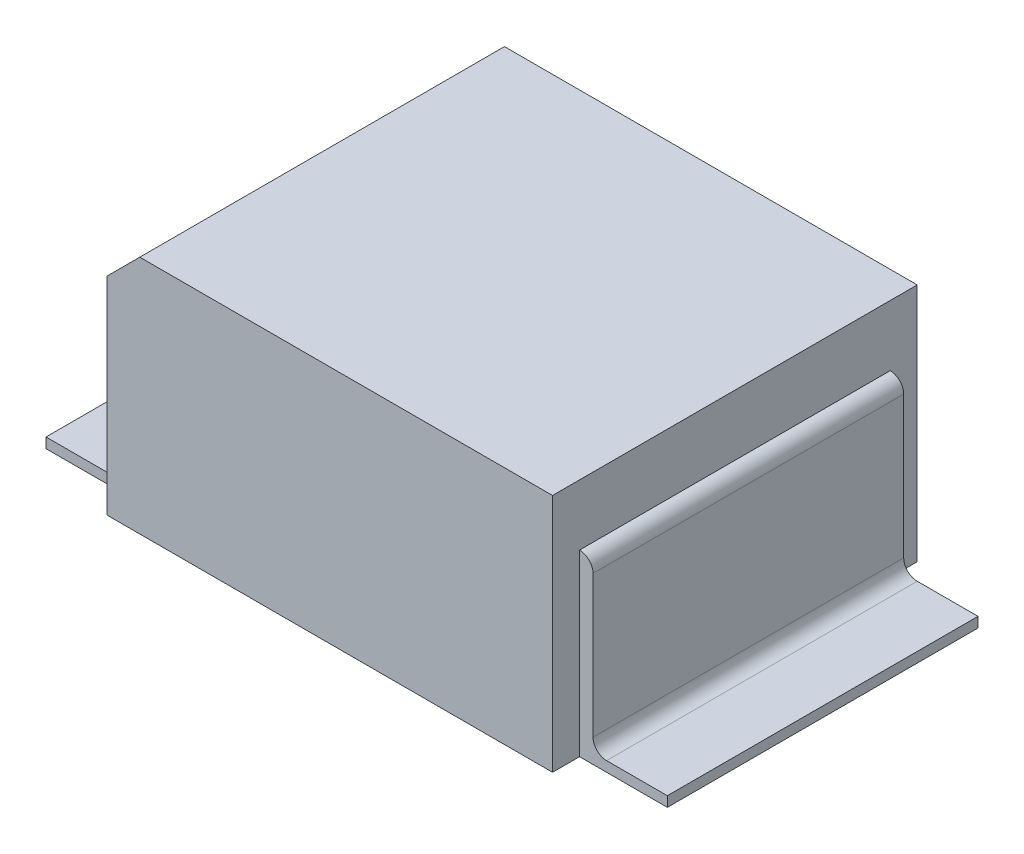
ISO-10303-21;
HEADER;
FILE_DESCRIPTION(('STEP AP214'),'2;1');
FILE_NAME('part.step','',(''),(''),'','','');
FILE_SCHEMA(('AUTOMOTIVE_DESIGN { 1 0 10303 214 1 1 1 1 }'));
ENDSEC;
DATA;
#1=APPLICATION_CONTEXT('core data for automotive mechanical design processes');
#2=APPLICATION_PROTOCOL_DEFINITION('international standard','automotive_design',2000,#1);
#3=PRODUCT_CONTEXT('',#1,'mechanical');
#4=PRODUCT('Part','Part','',(#3));
#5=PRODUCT_RELATED_PRODUCT_CATEGORY('part','',(#4));
#6=PRODUCT_DEFINITION_FORMATION('','',#4);
#7=PRODUCT_DEFINITION_CONTEXT('part definition',#1,'design');
#8=PRODUCT_DEFINITION('design','',#6,#7);
#9=PRODUCT_DEFINITION_SHAPE('','',#8);
#10=(LENGTH_UNIT() NAMED_UNIT(*) SI_UNIT(.MILLI.,.METRE.));
#11=(NAMED_UNIT(*) PLANE_ANGLE_UNIT() SI_UNIT($,.RADIAN.));
#12=(NAMED_UNIT(*) SI_UNIT($,.STERADIAN.) SOLID_ANGLE_UNIT());
#13=UNCERTAINTY_MEASURE_WITH_UNIT(LENGTH_MEASURE(1.E-05),#10,'distance_accuracy_value','');
#14=(GEOMETRIC_REPRESENTATION_CONTEXT(3) GLOBAL_UNCERTAINTY_ASSIGNED_CONTEXT((#13)) GLOBAL_UNIT_ASSIGNED_CONTEXT((#10,
#11,#12)) REPRESENTATION_CONTEXT('',''));
#15=CARTESIAN_POINT('',(0.,0.,0.));
#16=DIRECTION('',(0.,0.,1.));
#17=DIRECTION('',(1.,0.,0.));
#18=AXIS2_PLACEMENT_3D('',#15,#16,#17);
#19=CARTESIAN_POINT('',(-5.492180502066,1.7,9.977657827042));
#20=DIRECTION('',(0.,0.,-1.));
#21=DIRECTION('',(-1.,0.,0.));
#22=AXIS2_PLACEMENT_3D('',#19,#20,#21);
#23=CYLINDRICAL_SURFACE('',#22,0.1);
#24=CARTESIAN_POINT('',(-5.492180502066,1.7,9.977657827042));
#25=DIRECTION('',(0.,0.,-1.));
#26=DIRECTION('',(-1.,0.,0.));
#27=AXIS2_PLACEMENT_3D('',#24,#25,#26);
#28=CIRCLE('',#27,0.1);
#29=CARTESIAN_POINT('',(-5.392180502066,1.7,9.977657827042));
#30=VERTEX_POINT('',#29);
#31=CARTESIAN_POINT('',(-5.492180502066,1.6,9.977657827042));
#32=VERTEX_POINT('',#31);
#33=EDGE_CURVE('P0_E71',#30,#32,#28,.T.);
#34=ORIENTED_EDGE('',*,*,#33,.F.);
#35=DIRECTION('',(0.,0.,1.));
#36=VECTOR('',#35,1.);
#37=CARTESIAN_POINT('',(-5.392180502066,1.7,9.977657827042));
#38=LINE('',#37,#36);
#39=CARTESIAN_POINT('',(-5.392180502066,1.7,7.677657827042));
#40=VERTEX_POINT('',#39);
#41=EDGE_CURVE('P0_E87',#40,#30,#38,.T.);
#42=ORIENTED_EDGE('',*,*,#41,.F.);
#43=CARTESIAN_POINT('',(-5.492180502066,1.7,7.677657827042));
#44=DIRECTION('',(0.,0.,-1.));
#45=DIRECTION('',(-1.,0.,0.));
#46=AXIS2_PLACEMENT_3D('',#43,#44,#45);
#47=CIRCLE('',#46,0.1);
#48=CARTESIAN_POINT('',(-5.492180502066,1.6,7.677657827042));
#49=VERTEX_POINT('',#48);
#50=EDGE_CURVE('P0_E19',#49,#40,#47,.F.);
#51=ORIENTED_EDGE('',*,*,#50,.F.);
#52=DIRECTION('',(0.,0.,1.));
#53=VECTOR('',#52,1.);
#54=CARTESIAN_POINT('',(-5.492180502066,1.6,9.977657827042));
#55=LINE('',#54,#53);
#56=EDGE_CURVE('P0_E91',#32,#49,#55,.F.);
#57=ORIENTED_EDGE('',*,*,#56,.F.);
#58=EDGE_LOOP('',(#34,#42,#51,#57));
#59=FACE_BOUND('',#58,.T.);
#60=ADVANCED_FACE('P0_F16',(#59),#23,.F.);
#61=CARTESIAN_POINT('',(-5.392180502066,2.85,9.977657827042));
#62=DIRECTION('',(-1.,0.,0.));
#63=DIRECTION('',(0.,0.,1.));
#64=AXIS2_PLACEMENT_3D('',#61,#62,#63);
#65=PLANE('',#64);
#66=DIRECTION('',(0.,0.,-1.));
#67=VECTOR('',#66,1.);
#68=CARTESIAN_POINT('',(-5.392180502066,2.75,9.977657827042));
#69=LINE('',#68,#67);
#70=CARTESIAN_POINT('',(-5.392180502066,2.75,7.677657827042));
#71=VERTEX_POINT('',#70);
#72=CARTESIAN_POINT('',(-5.392180502066,2.75,9.977657827042));
#73=VERTEX_POINT('',#72);
#74=EDGE_CURVE('P0_E90',#71,#73,#69,.F.);
#75=ORIENTED_EDGE('',*,*,#74,.F.);
#76=DIRECTION('',(0.,1.,0.));
#77=VECTOR('',#76,1.);
#78=CARTESIAN_POINT('',(-5.392180502066,2.85,7.677657827042));
#79=LINE('',#78,#77);
#80=EDGE_CURVE('P0_E79',#71,#40,#79,.F.);
#81=ORIENTED_EDGE('',*,*,#80,.T.);
#82=ORIENTED_EDGE('',*,*,#41,.T.);
#83=DIRECTION('',(0.,1.,0.));
#84=VECTOR('',#83,1.);
#85=CARTESIAN_POINT('',(-5.392180502066,2.85,9.977657827042));
#86=LINE('',#85,#84);
#87=EDGE_CURVE('P0_E92',#30,#73,#86,.T.);
#88=ORIENTED_EDGE('',*,*,#87,.T.);
#89=EDGE_LOOP('',(#75,#81,#82,#88));
#90=FACE_BOUND('',#89,.T.);
#91=ADVANCED_FACE('P0_F85',(#90),#65,.T.);
#92=CARTESIAN_POINT('',(-5.392180502066,1.6,9.977657827042));
#93=DIRECTION('',(0.,1.,0.));
#94=DIRECTION('',(0.,0.,1.));
#95=AXIS2_PLACEMENT_3D('',#92,#93,#94);
#96=PLANE('',#95);
#97=DIRECTION('',(0.,0.,1.));
#98=VECTOR('',#97,1.);
#99=CARTESIAN_POINT('',(-5.942180502066,1.6,0.));
#100=LINE('',#99,#98);
#101=CARTESIAN_POINT('',(-5.942180502066,1.6,9.977657827042));
#102=VERTEX_POINT('',#101);
#103=CARTESIAN_POINT('',(-5.942180502066,1.6,7.677657827042));
#104=VERTEX_POINT('',#103);
#105=EDGE_CURVE('P0_E109',#102,#104,#100,.F.);
#106=ORIENTED_EDGE('',*,*,#105,.F.);
#107=DIRECTION('',(1.,0.,0.));
#108=VECTOR('',#107,1.);
#109=CARTESIAN_POINT('',(-5.392180502066,1.6,9.977657827042));
#110=LINE('',#109,#108);
#111=EDGE_CURVE('P0_E123',#102,#32,#110,.T.);
#112=ORIENTED_EDGE('',*,*,#111,.T.);
#113=ORIENTED_EDGE('',*,*,#56,.T.);
#114=DIRECTION('',(1.,0.,0.));
#115=VECTOR('',#114,1.);
#116=CARTESIAN_POINT('',(-5.392180502066,1.6,7.677657827042));
#117=LINE('',#116,#115);
#118=EDGE_CURVE('P0_E82',#49,#104,#117,.F.);
#119=ORIENTED_EDGE('',*,*,#118,.T.);
#120=EDGE_LOOP('',(#106,#112,#113,#119));
#121=FACE_BOUND('',#120,.T.);
#122=ADVANCED_FACE('P0_F165',(#121),#96,.T.);
#123=CARTESIAN_POINT('',(-5.942180502066,0.,0.));
#124=DIRECTION('',(-1.,0.,0.));
#125=DIRECTION('',(0.,0.,1.));
#126=AXIS2_PLACEMENT_3D('',#123,#124,#125);
#127=PLANE('',#126);
#128=DIRECTION('',(0.,1.,0.));
#129=VECTOR('',#128,1.);
#130=CARTESIAN_POINT('',(-5.942180502066,0.,9.977657827042));
#131=LINE('',#130,#129);
#132=CARTESIAN_POINT('',(-5.942180502066,1.525,9.977657827042));
#133=VERTEX_POINT('',#132);
#134=EDGE_CURVE('P0_E112',#133,#102,#131,.T.);
#135=ORIENTED_EDGE('',*,*,#134,.T.);
#136=ORIENTED_EDGE('',*,*,#105,.T.);
#137=DIRECTION('',(0.,1.,0.));
#138=VECTOR('',#137,1.);
#139=CARTESIAN_POINT('',(-5.942180502066,2.85,7.677657827042));
#140=LINE('',#139,#138);
#141=CARTESIAN_POINT('',(-5.942180502066,1.525,7.677657827042));
#142=VERTEX_POINT('',#141);
#143=EDGE_CURVE('P0_E103',#142,#104,#140,.T.);
#144=ORIENTED_EDGE('',*,*,#143,.F.);
#145=DIRECTION('',(0.,0.,1.));
#146=VECTOR('',#145,1.);
#147=CARTESIAN_POINT('',(-5.942180502066,1.525,0.277794904873787));
#148=LINE('',#147,#146);
#149=EDGE_CURVE('P0_E107',#142,#133,#148,.T.);
#150=ORIENTED_EDGE('',*,*,#149,.T.);
#151=EDGE_LOOP('',(#135,#136,#144,#150));
#152=FACE_BOUND('',#151,.T.);
#153=ADVANCED_FACE('P0_F162',(#152),#127,.T.);
#154=CARTESIAN_POINT('',(-5.292180502066,2.75,9.977657827042));
#155=DIRECTION('',(0.,0.,-1.));
#156=DIRECTION('',(-1.,0.,0.));
#157=AXIS2_PLACEMENT_3D('',#154,#155,#156);
#158=CYLINDRICAL_SURFACE('',#157,0.1);
#159=DIRECTION('',(0.,0.,1.));
#160=VECTOR('',#159,1.);
#161=CARTESIAN_POINT('',(-5.292180502066,2.85,8.827657827042));
#162=LINE('',#161,#160);
#163=CARTESIAN_POINT('',(-5.292180502066,2.85,9.977657827042));
#164=VERTEX_POINT('',#163);
#165=CARTESIAN_POINT('',(-5.292180502066,2.85,7.677657827042));
#166=VERTEX_POINT('',#165);
#167=EDGE_CURVE('P0_E100',#164,#166,#162,.F.);
#168=ORIENTED_EDGE('',*,*,#167,.T.);
#169=CARTESIAN_POINT('',(-5.292180502066,2.75,7.677657827042));
#170=DIRECTION('',(0.,0.,-1.));
#171=DIRECTION('',(-1.,0.,0.));
#172=AXIS2_PLACEMENT_3D('',#169,#170,#171);
#173=CIRCLE('',#172,0.1);
#174=EDGE_CURVE('P0_E101',#71,#166,#173,.T.);
#175=ORIENTED_EDGE('',*,*,#174,.F.);
#176=ORIENTED_EDGE('',*,*,#74,.T.);
#177=CARTESIAN_POINT('',(-5.292180502066,2.75,9.977657827042));
#178=DIRECTION('',(0.,0.,-1.));
#179=DIRECTION('',(-1.,0.,0.));
#180=AXIS2_PLACEMENT_3D('',#177,#178,#179);
#181=CIRCLE('',#180,0.1);
#182=EDGE_CURVE('P0_E98',#164,#73,#181,.F.);
#183=ORIENTED_EDGE('',*,*,#182,.F.);
#184=EDGE_LOOP('',(#168,#175,#176,#183));
#185=FACE_BOUND('',#184,.T.);
#186=ADVANCED_FACE('P0_F155',(#185),#158,.T.);
#187=CARTESIAN_POINT('',(-5.292180502066,2.85,7.677657827042));
#188=DIRECTION('',(0.,0.,-1.));
#189=DIRECTION('',(-1.,0.,0.));
#190=AXIS2_PLACEMENT_3D('',#187,#188,#189);
#191=PLANE('',#190);
#192=ORIENTED_EDGE('',*,*,#174,.T.);
#193=DIRECTION('',(0.,-1.,0.));
#194=VECTOR('',#193,1.);
#195=CARTESIAN_POINT('',(-5.292180502066,2.8,7.677657827042));
#196=LINE('',#195,#194);
#197=CARTESIAN_POINT('',(-5.292180502066,1.525,7.677657827042));
#198=VERTEX_POINT('',#197);
#199=EDGE_CURVE('P0_E141',#166,#198,#196,.T.);
#200=ORIENTED_EDGE('',*,*,#199,.T.);
#201=DIRECTION('',(1.,0.,0.));
#202=VECTOR('',#201,1.);
#203=CARTESIAN_POINT('',(-5.59218050206643,1.525,7.677657827042));
#204=LINE('',#203,#202);
#205=EDGE_CURVE('P0_E102',#198,#142,#204,.F.);
#206=ORIENTED_EDGE('',*,*,#205,.T.);
#207=ORIENTED_EDGE('',*,*,#143,.T.);
#208=ORIENTED_EDGE('',*,*,#118,.F.);
#209=ORIENTED_EDGE('',*,*,#50,.T.);
#210=ORIENTED_EDGE('',*,*,#80,.F.);
#211=EDGE_LOOP('',(#192,#200,#206,#207,#208,#209,#210));
#212=FACE_BOUND('',#211,.T.);
#213=ADVANCED_FACE('P0_F78',(#212),#191,.T.);
#214=CARTESIAN_POINT('',(-5.59218050206643,1.525,0.277794904873787));
#215=DIRECTION('',(0.,1.,0.));
#216=DIRECTION('',(0.,0.,1.));
#217=AXIS2_PLACEMENT_3D('',#214,#215,#216);
#218=PLANE('',#217);
#219=ORIENTED_EDGE('',*,*,#149,.F.);
#220=ORIENTED_EDGE('',*,*,#205,.F.);
#221=DIRECTION('',(0.,0.,1.));
#222=VECTOR('',#221,1.);
#223=CARTESIAN_POINT('',(-5.292180502066,1.525,8.827657827042));
#224=LINE('',#223,#222);
#225=CARTESIAN_POINT('',(-5.292180502066,1.525,9.977657827042));
#226=VERTEX_POINT('',#225);
#227=EDGE_CURVE('P0_E25',#198,#226,#224,.T.);
#228=ORIENTED_EDGE('',*,*,#227,.T.);
#229=DIRECTION('',(1.,0.,0.));
#230=VECTOR('',#229,1.);
#231=CARTESIAN_POINT('',(-5.292180502066,1.525,9.977657827042));
#232=LINE('',#231,#230);
#233=EDGE_CURVE('P0_E33',#133,#226,#232,.T.);
#234=ORIENTED_EDGE('',*,*,#233,.F.);
#235=EDGE_LOOP('',(#219,#220,#228,#234));
#236=FACE_BOUND('',#235,.T.);
#237=ADVANCED_FACE('P0_F161',(#236),#218,.F.);
#238=CARTESIAN_POINT('',(-5.292180502066,2.75,9.977657827042));
#239=DIRECTION('',(0.,0.,1.));
#240=DIRECTION('',(0.,-1.,0.));
#241=AXIS2_PLACEMENT_3D('',#238,#239,#240);
#242=PLANE('',#241);
#243=ORIENTED_EDGE('',*,*,#111,.F.);
#244=ORIENTED_EDGE('',*,*,#134,.F.);
#245=ORIENTED_EDGE('',*,*,#233,.T.);
#246=DIRECTION('',(0.,-1.,0.));
#247=VECTOR('',#246,1.);
#248=CARTESIAN_POINT('',(-5.292180502066,2.8,9.977657827042));
#249=LINE('',#248,#247);
#250=EDGE_CURVE('P0_E11',#226,#164,#249,.F.);
#251=ORIENTED_EDGE('',*,*,#250,.T.);
#252=ORIENTED_EDGE('',*,*,#182,.T.);
#253=ORIENTED_EDGE('',*,*,#87,.F.);
#254=ORIENTED_EDGE('',*,*,#33,.T.);
#255=EDGE_LOOP('',(#243,#244,#245,#251,#252,#253,#254));
#256=FACE_BOUND('',#255,.T.);
#257=ADVANCED_FACE('P0_F166',(#256),#242,.T.);
#258=CARTESIAN_POINT('',(-5.292180502066,2.8,8.827657827042));
#259=DIRECTION('',(-1.,0.,0.));
#260=DIRECTION('',(0.,-1.,0.));
#261=AXIS2_PLACEMENT_3D('',#258,#259,#260);
#262=PLANE('',#261);
#263=ORIENTED_EDGE('',*,*,#227,.F.);
#264=ORIENTED_EDGE('',*,*,#199,.F.);
#265=ORIENTED_EDGE('',*,*,#167,.F.);
#266=ORIENTED_EDGE('',*,*,#250,.F.);
#267=EDGE_LOOP('',(#263,#264,#265,#266));
#268=FACE_BOUND('',#267,.T.);
#269=ADVANCED_FACE('P0_F158',(#268),#262,.F.);
#270=CLOSED_SHELL('',(#60,#91,#122,#153,#186,#213,#237,#257,#269));
#271=MANIFOLD_SOLID_BREP('P0_B1',#270);
#272=CARTESIAN_POINT('',(-5.292180502066,3.05576560491204,7.477657827042));
#273=DIRECTION('',(0.707106781186544,-0.707106781186551,0.));
#274=DIRECTION('',(0.707106781186551,0.707106781186544,0.));
#275=AXIS2_PLACEMENT_3D('',#272,#273,#274);
#276=PLANE('',#275);
#277=DIRECTION('',(0.,0.,1.));
#278=VECTOR('',#277,1.);
#279=CARTESIAN_POINT('',(-5.04794610697804,3.3,8.827657827042));
#280=LINE('',#279,#278);
#281=CARTESIAN_POINT('',(-5.04794610697804,3.3,7.477657827042));
#282=VERTEX_POINT('',#281);
#283=CARTESIAN_POINT('',(-5.04794610697804,3.3,10.177657827042));
#284=VERTEX_POINT('',#283);
#285=EDGE_CURVE('P1_E74',#282,#284,#280,.T.);
#286=ORIENTED_EDGE('',*,*,#285,.F.);
#287=DIRECTION('',(0.70710678118655,0.707106781186545,0.));
#288=VECTOR('',#287,1.);
#289=CARTESIAN_POINT('',(-5.292180502066,3.05576560491204,7.477657827042));
#290=LINE('',#289,#288);
#291=CARTESIAN_POINT('',(-5.292180502066,3.05576560491204,7.477657827042));
#292=VERTEX_POINT('',#291);
#293=EDGE_CURVE('P1_E64',#292,#282,#290,.T.);
#294=ORIENTED_EDGE('',*,*,#293,.F.);
#295=DIRECTION('',(0.,0.,1.));
#296=VECTOR('',#295,1.);
#297=CARTESIAN_POINT('',(-5.292180502066,3.05576560491204,7.477657827042));
#298=LINE('',#297,#296);
#299=CARTESIAN_POINT('',(-5.292180502066,3.05576560491204,10.177657827042));
#300=VERTEX_POINT('',#299);
#301=EDGE_CURVE('P1_E59',#300,#292,#298,.F.);
#302=ORIENTED_EDGE('',*,*,#301,.F.);
#303=DIRECTION('',(0.707106781186551,0.707106781186544,0.));
#304=VECTOR('',#303,1.);
#305=CARTESIAN_POINT('',(-5.292180502066,3.05576560491204,10.177657827042));
#306=LINE('',#305,#304);
#307=EDGE_CURVE('P1_E19',#284,#300,#306,.F.);
#308=ORIENTED_EDGE('',*,*,#307,.F.);
#309=EDGE_LOOP('',(#286,#294,#302,#308));
#310=FACE_BOUND('',#309,.T.);
#311=ADVANCED_FACE('P1_F16',(#310),#276,.F.);
#312=CARTESIAN_POINT('',(-3.642180502066,3.3,8.827657827042));
#313=DIRECTION('',(0.,1.,0.));
#314=DIRECTION('',(0.,0.,1.));
#315=AXIS2_PLACEMENT_3D('',#312,#313,#314);
#316=PLANE('',#315);
#317=DIRECTION('',(0.,0.,-1.));
#318=VECTOR('',#317,1.);
#319=CARTESIAN_POINT('',(-1.992180502066,3.3,10.177657827042));
#320=LINE('',#319,#318);
#321=CARTESIAN_POINT('',(-1.992180502066,3.3,7.477657827042));
#322=VERTEX_POINT('',#321);
#323=CARTESIAN_POINT('',(-1.992180502066,3.3,10.177657827042));
#324=VERTEX_POINT('',#323);
#325=EDGE_CURVE('P1_E82',#322,#324,#320,.F.);
#326=ORIENTED_EDGE('',*,*,#325,.F.);
#327=DIRECTION('',(-1.,0.,0.));
#328=VECTOR('',#327,1.);
#329=CARTESIAN_POINT('',(-1.992180502066,3.3,7.477657827042));
#330=LINE('',#329,#328);
#331=EDGE_CURVE('P1_E70',#282,#322,#330,.F.);
#332=ORIENTED_EDGE('',*,*,#331,.F.);
#333=ORIENTED_EDGE('',*,*,#285,.T.);
#334=DIRECTION('',(1.,0.,0.));
#335=VECTOR('',#334,1.);
#336=CARTESIAN_POINT('',(-5.292180502066,3.3,10.177657827042));
#337=LINE('',#336,#335);
#338=EDGE_CURVE('P1_E89',#324,#284,#337,.F.);
#339=ORIENTED_EDGE('',*,*,#338,.F.);
#340=EDGE_LOOP('',(#326,#332,#333,#339));
#341=FACE_BOUND('',#340,.T.);
#342=ADVANCED_FACE('P1_F81',(#341),#316,.T.);
#343=CARTESIAN_POINT('',(-1.992180502066,1.5,7.477657827042));
#344=DIRECTION('',(0.,0.,-1.));
#345=DIRECTION('',(-1.,0.,0.));
#346=AXIS2_PLACEMENT_3D('',#343,#344,#345);
#347=PLANE('',#346);
#348=DIRECTION('',(1.,0.,0.));
#349=VECTOR('',#348,1.);
#350=CARTESIAN_POINT('',(-5.59218050206643,1.525,7.477657827042));
#351=LINE('',#350,#349);
#352=CARTESIAN_POINT('',(-1.992180502066,1.525,7.477657827042));
#353=VERTEX_POINT('',#352);
#354=CARTESIAN_POINT('',(-5.292180502066,1.525,7.477657827042));
#355=VERTEX_POINT('',#354);
#356=EDGE_CURVE('P1_E95',#353,#355,#351,.F.);
#357=ORIENTED_EDGE('',*,*,#356,.T.);
#358=DIRECTION('',(0.,1.,0.));
#359=VECTOR('',#358,1.);
#360=CARTESIAN_POINT('',(-5.292180502066,1.5,7.477657827042));
#361=LINE('',#360,#359);
#362=EDGE_CURVE('P1_E72',#292,#355,#361,.F.);
#363=ORIENTED_EDGE('',*,*,#362,.F.);
#364=ORIENTED_EDGE('',*,*,#293,.T.);
#365=ORIENTED_EDGE('',*,*,#331,.T.);
#366=DIRECTION('',(0.,1.,0.));
#367=VECTOR('',#366,1.);
#368=CARTESIAN_POINT('',(-1.992180502066,1.5,7.477657827042));
#369=LINE('',#368,#367);
#370=EDGE_CURVE('P1_E91',#353,#322,#369,.T.);
#371=ORIENTED_EDGE('',*,*,#370,.F.);
#372=EDGE_LOOP('',(#357,#363,#364,#365,#371));
#373=FACE_BOUND('',#372,.T.);
#374=ADVANCED_FACE('P1_F67',(#373),#347,.T.);
#375=CARTESIAN_POINT('',(-5.292180502066,1.5,7.477657827042));
#376=DIRECTION('',(-1.,0.,0.));
#377=DIRECTION('',(0.,0.,1.));
#378=AXIS2_PLACEMENT_3D('',#375,#376,#377);
#379=PLANE('',#378);
#380=DIRECTION('',(0.,0.,1.));
#381=VECTOR('',#380,1.);
#382=CARTESIAN_POINT('',(-5.292180502066,1.525,0.277794904873787));
#383=LINE('',#382,#381);
#384=CARTESIAN_POINT('',(-5.292180502066,1.525,10.177657827042));
#385=VERTEX_POINT('',#384);
#386=EDGE_CURVE('P1_E97',#355,#385,#383,.T.);
#387=ORIENTED_EDGE('',*,*,#386,.T.);
#388=DIRECTION('',(0.,1.,0.));
#389=VECTOR('',#388,1.);
#390=CARTESIAN_POINT('',(-5.292180502066,1.5,10.177657827042));
#391=LINE('',#390,#389);
#392=EDGE_CURVE('P1_E87',#300,#385,#391,.F.);
#393=ORIENTED_EDGE('',*,*,#392,.F.);
#394=ORIENTED_EDGE('',*,*,#301,.T.);
#395=ORIENTED_EDGE('',*,*,#362,.T.);
#396=EDGE_LOOP('',(#387,#393,#394,#395));
#397=FACE_BOUND('',#396,.T.);
#398=ADVANCED_FACE('P1_F107',(#397),#379,.T.);
#399=CARTESIAN_POINT('',(-5.292180502066,1.5,10.177657827042));
#400=DIRECTION('',(0.,0.,1.));
#401=DIRECTION('',(1.,0.,0.));
#402=AXIS2_PLACEMENT_3D('',#399,#400,#401);
#403=PLANE('',#402);
#404=DIRECTION('',(0.,1.,0.));
#405=VECTOR('',#404,1.);
#406=CARTESIAN_POINT('',(-1.992180502066,1.5,10.177657827042));
#407=LINE('',#406,#405);
#408=CARTESIAN_POINT('',(-1.992180502066,1.525,10.177657827042));
#409=VERTEX_POINT('',#408);
#410=EDGE_CURVE('P1_E33',#324,#409,#407,.F.);
#411=ORIENTED_EDGE('',*,*,#410,.F.);
#412=ORIENTED_EDGE('',*,*,#338,.T.);
#413=ORIENTED_EDGE('',*,*,#307,.T.);
#414=ORIENTED_EDGE('',*,*,#392,.T.);
#415=DIRECTION('',(1.,0.,0.));
#416=VECTOR('',#415,1.);
#417=CARTESIAN_POINT('',(-5.59218050206643,1.525,10.177657827042));
#418=LINE('',#417,#416);
#419=EDGE_CURVE('P1_E25',#385,#409,#418,.T.);
#420=ORIENTED_EDGE('',*,*,#419,.T.);
#421=EDGE_LOOP('',(#411,#412,#413,#414,#420));
#422=FACE_BOUND('',#421,.T.);
#423=ADVANCED_FACE('P1_F103',(#422),#403,.T.);
#424=CARTESIAN_POINT('',(-1.992180502066,1.5,10.177657827042));
#425=DIRECTION('',(1.,0.,0.));
#426=DIRECTION('',(0.,0.,-1.));
#427=AXIS2_PLACEMENT_3D('',#424,#425,#426);
#428=PLANE('',#427);
#429=ORIENTED_EDGE('',*,*,#325,.T.);
#430=ORIENTED_EDGE('',*,*,#410,.T.);
#431=DIRECTION('',(0.,0.,1.));
#432=VECTOR('',#431,1.);
#433=CARTESIAN_POINT('',(-1.992180502066,1.525,0.277794904873787));
#434=LINE('',#433,#432);
#435=EDGE_CURVE('P1_E11',#409,#353,#434,.F.);
#436=ORIENTED_EDGE('',*,*,#435,.T.);
#437=ORIENTED_EDGE('',*,*,#370,.T.);
#438=EDGE_LOOP('',(#429,#430,#436,#437));
#439=FACE_BOUND('',#438,.T.);
#440=ADVANCED_FACE('P1_F115',(#439),#428,.T.);
#441=CARTESIAN_POINT('',(-5.59218050206643,1.525,0.277794904873787));
#442=DIRECTION('',(0.,1.,0.));
#443=DIRECTION('',(0.,0.,1.));
#444=AXIS2_PLACEMENT_3D('',#441,#442,#443);
#445=PLANE('',#444);
#446=ORIENTED_EDGE('',*,*,#419,.F.);
#447=ORIENTED_EDGE('',*,*,#386,.F.);
#448=ORIENTED_EDGE('',*,*,#356,.F.);
#449=ORIENTED_EDGE('',*,*,#435,.F.);
#450=EDGE_LOOP('',(#446,#447,#448,#449));
#451=FACE_BOUND('',#450,.T.);
#452=ADVANCED_FACE('P1_F106',(#451),#445,.F.);
#453=CLOSED_SHELL('',(#311,#342,#374,#398,#423,#440,#452));
#454=MANIFOLD_SOLID_BREP('P1_B1',#453);
#455=CARTESIAN_POINT('',(-1.792180502066,1.7,9.977657827042));
#456=DIRECTION('',(0.,0.,-1.));
#457=DIRECTION('',(0.,1.,0.));
#458=AXIS2_PLACEMENT_3D('',#455,#456,#457);
#459=CYLINDRICAL_SURFACE('',#458,0.1);
#460=CARTESIAN_POINT('',(-1.792180502066,1.7,9.977657827042));
#461=DIRECTION('',(0.,0.,-1.));
#462=DIRECTION('',(0.,1.,0.));
#463=AXIS2_PLACEMENT_3D('',#460,#461,#462);
#464=CIRCLE('',#463,0.1);
#465=CARTESIAN_POINT('',(-1.792180502066,1.6,9.977657827042));
#466=VERTEX_POINT('',#465);
#467=CARTESIAN_POINT('',(-1.892180502066,1.7,9.977657827042));
#468=VERTEX_POINT('',#467);
#469=EDGE_CURVE('P2_E60',#466,#468,#464,.T.);
#470=ORIENTED_EDGE('',*,*,#469,.F.);
#471=DIRECTION('',(0.,0.,-1.));
#472=VECTOR('',#471,1.);
#473=CARTESIAN_POINT('',(-1.792180502066,1.6,9.977657827042));
#474=LINE('',#473,#472);
#475=CARTESIAN_POINT('',(-1.792180502066,1.6,7.677657827042));
#476=VERTEX_POINT('',#475);
#477=EDGE_CURVE('P2_E75',#466,#476,#474,.T.);
#478=ORIENTED_EDGE('',*,*,#477,.T.);
#479=CARTESIAN_POINT('',(-1.792180502066,1.7,7.677657827042));
#480=DIRECTION('',(0.,0.,-1.));
#481=DIRECTION('',(0.,1.,0.));
#482=AXIS2_PLACEMENT_3D('',#479,#480,#481);
#483=CIRCLE('',#482,0.1);
#484=CARTESIAN_POINT('',(-1.892180502066,1.7,7.677657827042));
#485=VERTEX_POINT('',#484);
#486=EDGE_CURVE('P2_E19',#485,#476,#483,.F.);
#487=ORIENTED_EDGE('',*,*,#486,.F.);
#488=DIRECTION('',(0.,0.,1.));
#489=VECTOR('',#488,1.);
#490=CARTESIAN_POINT('',(-1.892180502066,1.7,9.977657827042));
#491=LINE('',#490,#489);
#492=EDGE_CURVE('P2_E95',#485,#468,#491,.T.);
#493=ORIENTED_EDGE('',*,*,#492,.T.);
#494=EDGE_LOOP('',(#470,#478,#487,#493));
#495=FACE_BOUND('',#494,.T.);
#496=ADVANCED_FACE('P2_F16',(#495),#459,.F.);
#497=CARTESIAN_POINT('',(-1.892180502066,1.6,9.977657827042));
#498=DIRECTION('',(0.,-1.,0.));
#499=DIRECTION('',(0.,0.,-1.));
#500=AXIS2_PLACEMENT_3D('',#497,#498,#499);
#501=PLANE('',#500);
#502=DIRECTION('',(1.,0.,0.));
#503=VECTOR('',#502,1.);
#504=CARTESIAN_POINT('',(-1.892180502066,1.6,9.977657827042));
#505=LINE('',#504,#503);
#506=CARTESIAN_POINT('',(-1.342180502066,1.6,9.977657827042));
#507=VERTEX_POINT('',#506);
#508=EDGE_CURVE('P2_E79',#507,#466,#505,.F.);
#509=ORIENTED_EDGE('',*,*,#508,.F.);
#510=DIRECTION('',(0.,0.,-1.));
#511=VECTOR('',#510,1.);
#512=CARTESIAN_POINT('',(-1.342180502066,1.6,0.));
#513=LINE('',#512,#511);
#514=CARTESIAN_POINT('',(-1.342180502066,1.6,7.677657827042));
#515=VERTEX_POINT('',#514);
#516=EDGE_CURVE('P2_E83',#515,#507,#513,.F.);
#517=ORIENTED_EDGE('',*,*,#516,.F.);
#518=DIRECTION('',(1.,0.,0.));
#519=VECTOR('',#518,1.);
#520=CARTESIAN_POINT('',(-1.892180502066,1.6,7.677657827042));
#521=LINE('',#520,#519);
#522=EDGE_CURVE('P2_E69',#476,#515,#521,.T.);
#523=ORIENTED_EDGE('',*,*,#522,.F.);
#524=ORIENTED_EDGE('',*,*,#477,.F.);
#525=EDGE_LOOP('',(#509,#517,#523,#524));
#526=FACE_BOUND('',#525,.T.);
#527=ADVANCED_FACE('P2_F81',(#526),#501,.F.);
#528=CARTESIAN_POINT('',(-1.892180502066,2.85,9.977657827042));
#529=DIRECTION('',(-1.,0.,0.));
#530=DIRECTION('',(0.,0.,1.));
#531=AXIS2_PLACEMENT_3D('',#528,#529,#530);
#532=PLANE('',#531);
#533=DIRECTION('',(0.,1.,0.));
#534=VECTOR('',#533,1.);
#535=CARTESIAN_POINT('',(-1.892180502066,2.85,7.677657827042));
#536=LINE('',#535,#534);
#537=CARTESIAN_POINT('',(-1.892180502066,2.75,7.677657827042));
#538=VERTEX_POINT('',#537);
#539=EDGE_CURVE('P2_E72',#538,#485,#536,.F.);
#540=ORIENTED_EDGE('',*,*,#539,.F.);
#541=DIRECTION('',(0.,0.,-1.));
#542=VECTOR('',#541,1.);
#543=CARTESIAN_POINT('',(-1.892180502066,2.75,9.977657827042));
#544=LINE('',#543,#542);
#545=CARTESIAN_POINT('',(-1.892180502066,2.75,9.977657827042));
#546=VERTEX_POINT('',#545);
#547=EDGE_CURVE('P2_E111',#546,#538,#544,.T.);
#548=ORIENTED_EDGE('',*,*,#547,.F.);
#549=DIRECTION('',(0.,1.,0.));
#550=VECTOR('',#549,1.);
#551=CARTESIAN_POINT('',(-1.892180502066,2.85,9.977657827042));
#552=LINE('',#551,#550);
#553=EDGE_CURVE('P2_E78',#468,#546,#552,.T.);
#554=ORIENTED_EDGE('',*,*,#553,.F.);
#555=ORIENTED_EDGE('',*,*,#492,.F.);
#556=EDGE_LOOP('',(#540,#548,#554,#555));
#557=FACE_BOUND('',#556,.T.);
#558=ADVANCED_FACE('P2_F213',(#557),#532,.F.);
#559=CARTESIAN_POINT('',(-1.342180502066,0.,0.));
#560=DIRECTION('',(1.,0.,0.));
#561=DIRECTION('',(0.,0.,-1.));
#562=AXIS2_PLACEMENT_3D('',#559,#560,#561);
#563=PLANE('',#562);
#564=DIRECTION('',(0.,0.,1.));
#565=VECTOR('',#564,1.);
#566=CARTESIAN_POINT('',(-1.342180502066,1.525,0.277794904873787));
#567=LINE('',#566,#565);
#568=CARTESIAN_POINT('',(-1.342180502066,1.525,9.977657827042));
#569=VERTEX_POINT('',#568);
#570=CARTESIAN_POINT('',(-1.342180502066,1.525,7.677657827042));
#571=VERTEX_POINT('',#570);
#572=EDGE_CURVE('P2_E103',#569,#571,#567,.F.);
#573=ORIENTED_EDGE('',*,*,#572,.T.);
#574=DIRECTION('',(0.,1.,0.));
#575=VECTOR('',#574,1.);
#576=CARTESIAN_POINT('',(-1.342180502066,0.,7.677657827042));
#577=LINE('',#576,#575);
#578=EDGE_CURVE('P2_E122',#571,#515,#577,.T.);
#579=ORIENTED_EDGE('',*,*,#578,.T.);
#580=ORIENTED_EDGE('',*,*,#516,.T.);
#581=DIRECTION('',(0.,1.,0.));
#582=VECTOR('',#581,1.);
#583=CARTESIAN_POINT('',(-1.342180502066,0.,9.977657827042));
#584=LINE('',#583,#582);
#585=EDGE_CURVE('P2_E123',#507,#569,#584,.F.);
#586=ORIENTED_EDGE('',*,*,#585,.T.);
#587=EDGE_LOOP('',(#573,#579,#580,#586));
#588=FACE_BOUND('',#587,.T.);
#589=ADVANCED_FACE('P2_F133',(#588),#563,.T.);
#590=CARTESIAN_POINT('',(-5.59218050206643,1.525,0.277794904873787));
#591=DIRECTION('',(0.,1.,0.));
#592=DIRECTION('',(0.,0.,1.));
#593=AXIS2_PLACEMENT_3D('',#590,#591,#592);
#594=PLANE('',#593);
#595=DIRECTION('',(0.,0.,1.));
#596=VECTOR('',#595,1.);
#597=CARTESIAN_POINT('',(-1.992180502066,1.525,8.827657827042));
#598=LINE('',#597,#596);
#599=CARTESIAN_POINT('',(-1.992180502066,1.525,7.677657827042));
#600=VERTEX_POINT('',#599);
#601=CARTESIAN_POINT('',(-1.992180502066,1.525,9.977657827042));
#602=VERTEX_POINT('',#601);
#603=EDGE_CURVE('P2_E143',#600,#602,#598,.T.);
#604=ORIENTED_EDGE('',*,*,#603,.F.);
#605=DIRECTION('',(1.,0.,0.));
#606=VECTOR('',#605,1.);
#607=CARTESIAN_POINT('',(-1.992180502066,1.525,7.677657827042));
#608=LINE('',#607,#606);
#609=EDGE_CURVE('P2_E98',#600,#571,#608,.T.);
#610=ORIENTED_EDGE('',*,*,#609,.T.);
#611=ORIENTED_EDGE('',*,*,#572,.F.);
#612=DIRECTION('',(1.,0.,0.));
#613=VECTOR('',#612,1.);
#614=CARTESIAN_POINT('',(-1.992180502066,1.525,9.977657827042));
#615=LINE('',#614,#613);
#616=EDGE_CURVE('P2_E100',#569,#602,#615,.F.);
#617=ORIENTED_EDGE('',*,*,#616,.T.);
#618=EDGE_LOOP('',(#604,#610,#611,#617));
#619=FACE_BOUND('',#618,.T.);
#620=ADVANCED_FACE('P2_F145',(#619),#594,.F.);
#621=CARTESIAN_POINT('',(-1.992180502066,2.75,9.977657827042));
#622=DIRECTION('',(0.,0.,-1.));
#623=DIRECTION('',(0.,1.,0.));
#624=AXIS2_PLACEMENT_3D('',#621,#622,#623);
#625=PLANE('',#624);
#626=ORIENTED_EDGE('',*,*,#616,.F.);
#627=ORIENTED_EDGE('',*,*,#585,.F.);
#628=ORIENTED_EDGE('',*,*,#508,.T.);
#629=ORIENTED_EDGE('',*,*,#469,.T.);
#630=ORIENTED_EDGE('',*,*,#553,.T.);
#631=CARTESIAN_POINT('',(-1.992180502066,2.75,9.977657827042));
#632=DIRECTION('',(0.,0.,-1.));
#633=DIRECTION('',(-1.,0.,0.));
#634=AXIS2_PLACEMENT_3D('',#631,#632,#633);
#635=CIRCLE('',#634,0.1);
#636=CARTESIAN_POINT('',(-1.992180502066,2.85,9.977657827042));
#637=VERTEX_POINT('',#636);
#638=EDGE_CURVE('P2_E99',#637,#546,#635,.T.);
#639=ORIENTED_EDGE('',*,*,#638,.F.);
#640=DIRECTION('',(0.,-1.,0.));
#641=VECTOR('',#640,1.);
#642=CARTESIAN_POINT('',(-1.992180502066,2.8,9.977657827042));
#643=LINE('',#642,#641);
#644=EDGE_CURVE('P2_E148',#602,#637,#643,.F.);
#645=ORIENTED_EDGE('',*,*,#644,.F.);
#646=EDGE_LOOP('',(#626,#627,#628,#629,#630,#639,#645));
#647=FACE_BOUND('',#646,.T.);
#648=ADVANCED_FACE('P2_F162',(#647),#625,.F.);
#649=CARTESIAN_POINT('',(-1.992180502066,2.75,9.977657827042));
#650=DIRECTION('',(0.,0.,-1.));
#651=DIRECTION('',(-1.,0.,0.));
#652=AXIS2_PLACEMENT_3D('',#649,#650,#651);
#653=CYLINDRICAL_SURFACE('',#652,0.1);
#654=CARTESIAN_POINT('',(-1.992180502066,2.75,7.677657827042));
#655=DIRECTION('',(0.,0.,-1.));
#656=DIRECTION('',(-1.,0.,0.));
#657=AXIS2_PLACEMENT_3D('',#654,#655,#656);
#658=CIRCLE('',#657,0.1);
#659=CARTESIAN_POINT('',(-1.992180502066,2.85,7.677657827042));
#660=VERTEX_POINT('',#659);
#661=EDGE_CURVE('P2_E34',#538,#660,#658,.F.);
#662=ORIENTED_EDGE('',*,*,#661,.T.);
#663=DIRECTION('',(0.,0.,1.));
#664=VECTOR('',#663,1.);
#665=CARTESIAN_POINT('',(-1.992180502066,2.85,8.827657827042));
#666=LINE('',#665,#664);
#667=EDGE_CURVE('P2_E25',#637,#660,#666,.F.);
#668=ORIENTED_EDGE('',*,*,#667,.F.);
#669=ORIENTED_EDGE('',*,*,#638,.T.);
#670=ORIENTED_EDGE('',*,*,#547,.T.);
#671=EDGE_LOOP('',(#662,#668,#669,#670));
#672=FACE_BOUND('',#671,.T.);
#673=ADVANCED_FACE('P2_F160',(#672),#653,.T.);
#674=CARTESIAN_POINT('',(-1.992180502066,2.85,7.677657827042));
#675=DIRECTION('',(0.,0.,1.));
#676=DIRECTION('',(0.,-1.,0.));
#677=AXIS2_PLACEMENT_3D('',#674,#675,#676);
#678=PLANE('',#677);
#679=ORIENTED_EDGE('',*,*,#578,.F.);
#680=ORIENTED_EDGE('',*,*,#609,.F.);
#681=DIRECTION('',(0.,-1.,0.));
#682=VECTOR('',#681,1.);
#683=CARTESIAN_POINT('',(-1.992180502066,2.8,7.677657827042));
#684=LINE('',#683,#682);
#685=EDGE_CURVE('P2_E11',#660,#600,#684,.T.);
#686=ORIENTED_EDGE('',*,*,#685,.F.);
#687=ORIENTED_EDGE('',*,*,#661,.F.);
#688=ORIENTED_EDGE('',*,*,#539,.T.);
#689=ORIENTED_EDGE('',*,*,#486,.T.);
#690=ORIENTED_EDGE('',*,*,#522,.T.);
#691=EDGE_LOOP('',(#679,#680,#686,#687,#688,#689,#690));
#692=FACE_BOUND('',#691,.T.);
#693=ADVANCED_FACE('P2_F67',(#692),#678,.F.);
#694=CARTESIAN_POINT('',(-1.992180502066,2.8,8.827657827042));
#695=DIRECTION('',(-1.,0.,0.));
#696=DIRECTION('',(0.,-1.,0.));
#697=AXIS2_PLACEMENT_3D('',#694,#695,#696);
#698=PLANE('',#697);
#699=ORIENTED_EDGE('',*,*,#667,.T.);
#700=ORIENTED_EDGE('',*,*,#685,.T.);
#701=ORIENTED_EDGE('',*,*,#603,.T.);
#702=ORIENTED_EDGE('',*,*,#644,.T.);
#703=EDGE_LOOP('',(#699,#700,#701,#702));
#704=FACE_BOUND('',#703,.T.);
#705=ADVANCED_FACE('P2_F152',(#704),#698,.T.);
#706=CLOSED_SHELL('',(#496,#527,#558,#589,#620,#648,#673,#693,#705));
#707=MANIFOLD_SOLID_BREP('P2_B1',#706);
#708=ADVANCED_BREP_SHAPE_REPRESENTATION('',(#18,#271,#454,#707),#14);
#709=SHAPE_DEFINITION_REPRESENTATION(#9,#708);
ENDSEC;
END-ISO-10303-21;
